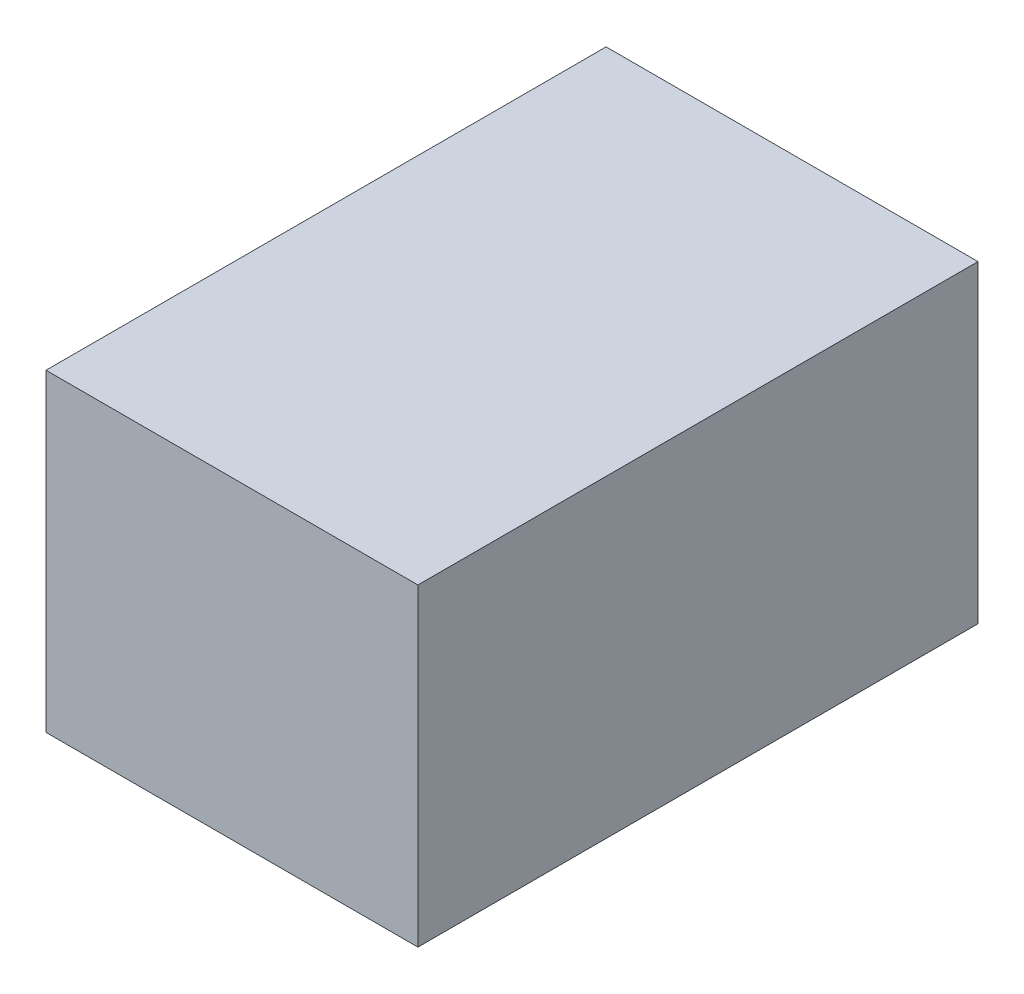
ISO-10303-21;
HEADER;
FILE_DESCRIPTION(('STEP AP214'),'2;1');
FILE_NAME('part.step','',(''),(''),'','','');
FILE_SCHEMA(('AUTOMOTIVE_DESIGN { 1 0 10303 214 1 1 1 1 }'));
ENDSEC;
DATA;
#1=APPLICATION_CONTEXT('core data for automotive mechanical design processes');
#2=APPLICATION_PROTOCOL_DEFINITION('international standard','automotive_design',2000,#1);
#3=PRODUCT_CONTEXT('',#1,'mechanical');
#4=PRODUCT('Part','Part','',(#3));
#5=PRODUCT_RELATED_PRODUCT_CATEGORY('part','',(#4));
#6=PRODUCT_DEFINITION_FORMATION('','',#4);
#7=PRODUCT_DEFINITION_CONTEXT('part definition',#1,'design');
#8=PRODUCT_DEFINITION('design','',#6,#7);
#9=PRODUCT_DEFINITION_SHAPE('','',#8);
#10=(LENGTH_UNIT() NAMED_UNIT(*) SI_UNIT(.MILLI.,.METRE.));
#11=(NAMED_UNIT(*) PLANE_ANGLE_UNIT() SI_UNIT($,.RADIAN.));
#12=(NAMED_UNIT(*) SI_UNIT($,.STERADIAN.) SOLID_ANGLE_UNIT());
#13=UNCERTAINTY_MEASURE_WITH_UNIT(LENGTH_MEASURE(1.E-05),#10,'distance_accuracy_value','');
#14=(GEOMETRIC_REPRESENTATION_CONTEXT(3) GLOBAL_UNCERTAINTY_ASSIGNED_CONTEXT((#13)) GLOBAL_UNIT_ASSIGNED_CONTEXT((#10,
#11,#12)) REPRESENTATION_CONTEXT('',''));
#15=CARTESIAN_POINT('',(0.,0.,0.));
#16=DIRECTION('',(0.,0.,1.));
#17=DIRECTION('',(1.,0.,0.));
#18=AXIS2_PLACEMENT_3D('',#15,#16,#17);
#19=CARTESIAN_POINT('',(-3.15,1.68383766961011,-5.12945897577526));
#20=DIRECTION('',(1.,0.,0.));
#21=DIRECTION('',(0.,0.,-1.));
#22=AXIS2_PLACEMENT_3D('',#19,#20,#21);
#23=PLANE('',#22);
#24=DIRECTION('',(0.,-0.173754346970263,-0.984789026598559));
#25=VECTOR('',#24,1.);
#26=CARTESIAN_POINT('',(-3.15,-0.0851061455947079,-3.64481386263141));
#27=LINE('',#26,#25);
#28=CARTESIAN_POINT('',(-3.15,-0.085106145594708,-3.64481386263141));
#29=VERTEX_POINT('',#28);
#30=CARTESIAN_POINT('',(-3.15,0.11552809239759,-2.50767744342807));
#31=VERTEX_POINT('',#30);
#32=EDGE_CURVE('E250',#29,#31,#27,.F.);
#33=ORIENTED_EDGE('',*,*,#32,.T.);
#34=DIRECTION('',(0.,-0.939729487887633,-0.341918834805057));
#35=VECTOR('',#34,1.);
#36=CARTESIAN_POINT('',(-3.15,0.11552809239759,-2.50767744342807));
#37=LINE('',#36,#35);
#38=CARTESIAN_POINT('',(-3.15,1.2006342379923,-2.11286358079666));
#39=VERTEX_POINT('',#38);
#40=EDGE_CURVE('E256',#31,#39,#37,.F.);
#41=ORIENTED_EDGE('',*,*,#40,.T.);
#42=DIRECTION('',(0.,-0.765975140917371,0.642870191793502));
#43=VECTOR('',#42,1.);
#44=CARTESIAN_POINT('',(-3.15,1.2006342379923,-2.11286358079666));
#45=LINE('',#44,#43);
#46=CARTESIAN_POINT('',(-3.15,2.08510614559471,-2.85518613736859));
#47=VERTEX_POINT('',#46);
#48=EDGE_CURVE('E262',#39,#47,#45,.F.);
#49=ORIENTED_EDGE('',*,*,#48,.T.);
#50=DIRECTION('',(0.,0.173754346970264,0.984789026598559));
#51=VECTOR('',#50,1.);
#52=CARTESIAN_POINT('',(-3.15,2.08510614559471,-2.85518613736859));
#53=LINE('',#52,#51);
#54=CARTESIAN_POINT('',(-3.15,1.88447190760241,-3.99232255657193));
#55=VERTEX_POINT('',#54);
#56=EDGE_CURVE('E145',#47,#55,#53,.F.);
#57=ORIENTED_EDGE('',*,*,#56,.T.);
#58=DIRECTION('',(0.,0.939729487887632,0.341918834805058));
#59=VECTOR('',#58,1.);
#60=CARTESIAN_POINT('',(-3.15,1.88447190760241,-3.99232255657193));
#61=LINE('',#60,#59);
#62=CARTESIAN_POINT('',(-3.15,0.799365762007703,-4.38713641920334));
#63=VERTEX_POINT('',#62);
#64=EDGE_CURVE('E127',#55,#63,#61,.F.);
#65=ORIENTED_EDGE('',*,*,#64,.T.);
#66=DIRECTION('',(0.,0.765975140917371,-0.642870191793502));
#67=VECTOR('',#66,1.);
#68=CARTESIAN_POINT('',(-3.15,0.799365762007703,-4.38713641920334));
#69=LINE('',#68,#67);
#70=EDGE_CURVE('E133',#63,#29,#69,.F.);
#71=ORIENTED_EDGE('',*,*,#70,.T.);
#72=EDGE_LOOP('',(#33,#41,#49,#57,#65,#71));
#73=FACE_BOUND('',#72,.T.);
#74=ADVANCED_FACE('F16',(#73),#23,.F.);
#75=CARTESIAN_POINT('',(-3.15,-0.154685570206259,3.24412060455637));
#76=DIRECTION('',(1.,0.,0.));
#77=DIRECTION('',(0.,0.,-1.));
#78=AXIS2_PLACEMENT_3D('',#75,#76,#77);
#79=PLANE('',#78);
#80=DIRECTION('',(0.,-0.999987037181939,-0.00509170581307389));
#81=VECTOR('',#80,1.);
#82=CARTESIAN_POINT('',(-3.15,0.417565509083797,4.24704733946012));
#83=LINE('',#82,#81);
#84=CARTESIAN_POINT('',(-3.15,0.417565509083797,4.24704733946012));
#85=VERTEX_POINT('',#84);
#86=CARTESIAN_POINT('',(-3.15,1.57225107929006,4.25292673490375));
#87=VERTEX_POINT('',#86);
#88=EDGE_CURVE('E215',#85,#87,#83,.F.);
#89=ORIENTED_EDGE('',*,*,#88,.T.);
#90=DIRECTION('',(0.,-0.504403065173688,0.863468324748157));
#91=VECTOR('',#90,1.);
#92=CARTESIAN_POINT('',(-3.15,1.57225107929006,4.25292673490375));
#93=LINE('',#92,#91);
#94=CARTESIAN_POINT('',(-3.15,2.15468557020626,3.25587939544362));
#95=VERTEX_POINT('',#94);
#96=EDGE_CURVE('E224',#87,#95,#93,.F.);
#97=ORIENTED_EDGE('',*,*,#96,.T.);
#98=DIRECTION('',(0.,0.495583972008252,0.86856003056123));
#99=VECTOR('',#98,1.);
#100=CARTESIAN_POINT('',(-3.15,2.15468557020626,3.25587939544362));
#101=LINE('',#100,#99);
#102=CARTESIAN_POINT('',(-3.15,1.5824344909162,2.25295266053987));
#103=VERTEX_POINT('',#102);
#104=EDGE_CURVE('E230',#95,#103,#101,.F.);
#105=ORIENTED_EDGE('',*,*,#104,.T.);
#106=DIRECTION('',(0.,0.999987037181939,0.00509170581307202));
#107=VECTOR('',#106,1.);
#108=CARTESIAN_POINT('',(-3.15,1.5824344909162,2.25295266053987));
#109=LINE('',#108,#107);
#110=CARTESIAN_POINT('',(-3.15,0.427748920709943,2.24707326509625));
#111=VERTEX_POINT('',#110);
#112=EDGE_CURVE('E236',#103,#111,#109,.F.);
#113=ORIENTED_EDGE('',*,*,#112,.T.);
#114=DIRECTION('',(0.,0.504403065173688,-0.863468324748156));
#115=VECTOR('',#114,1.);
#116=CARTESIAN_POINT('',(-3.15,0.427748920709943,2.24707326509625));
#117=LINE('',#116,#115);
#118=CARTESIAN_POINT('',(-3.15,-0.154685570206259,3.24412060455637));
#119=VERTEX_POINT('',#118);
#120=EDGE_CURVE('E242',#111,#119,#117,.F.);
#121=ORIENTED_EDGE('',*,*,#120,.T.);
#122=DIRECTION('',(0.,-0.495583972008252,-0.868560030561229));
#123=VECTOR('',#122,1.);
#124=CARTESIAN_POINT('',(-3.15,-0.154685570206259,3.24412060455637));
#125=LINE('',#124,#123);
#126=EDGE_CURVE('E245',#119,#85,#125,.F.);
#127=ORIENTED_EDGE('',*,*,#126,.T.);
#128=EDGE_LOOP('',(#89,#97,#105,#113,#121,#127));
#129=FACE_BOUND('',#128,.T.);
#130=ADVANCED_FACE('F552',(#129),#79,.F.);
#131=CARTESIAN_POINT('',(-3.15,0.799365762007703,-4.38713641920334));
#132=DIRECTION('',(0.,-0.642870191793502,-0.765975140917371));
#133=DIRECTION('',(0.,0.765975140917371,-0.642870191793502));
#134=AXIS2_PLACEMENT_3D('',#131,#132,#133);
#135=PLANE('',#134);
#136=DIRECTION('',(1.,0.,0.));
#137=VECTOR('',#136,1.);
#138=CARTESIAN_POINT('',(-3.15,-0.0851061455947079,-3.64481386263141));
#139=LINE('',#138,#137);
#140=CARTESIAN_POINT('',(-4.15,-0.0851061455947079,-3.64481386263141));
#141=VERTEX_POINT('',#140);
#142=EDGE_CURVE('E138',#141,#29,#139,.T.);
#143=ORIENTED_EDGE('',*,*,#142,.T.);
#144=ORIENTED_EDGE('',*,*,#70,.F.);
#145=DIRECTION('',(1.,0.,0.));
#146=VECTOR('',#145,1.);
#147=CARTESIAN_POINT('',(-3.15,0.799365762007703,-4.38713641920334));
#148=LINE('',#147,#146);
#149=CARTESIAN_POINT('',(-4.15,0.799365762007703,-4.38713641920334));
#150=VERTEX_POINT('',#149);
#151=EDGE_CURVE('E136',#63,#150,#148,.F.);
#152=ORIENTED_EDGE('',*,*,#151,.T.);
#153=DIRECTION('',(0.,0.765975140917371,-0.642870191793502));
#154=VECTOR('',#153,1.);
#155=CARTESIAN_POINT('',(-4.15,-0.0851061455947079,-3.64481386263141));
#156=LINE('',#155,#154);
#157=EDGE_CURVE('E210',#141,#150,#156,.T.);
#158=ORIENTED_EDGE('',*,*,#157,.F.);
#159=EDGE_LOOP('',(#143,#144,#152,#158));
#160=FACE_BOUND('',#159,.T.);
#161=ADVANCED_FACE('F134',(#160),#135,.F.);
#162=CARTESIAN_POINT('',(-3.15,1.88447190760241,-3.99232255657193));
#163=DIRECTION('',(0.,0.341918834805058,-0.939729487887632));
#164=DIRECTION('',(0.,0.939729487887632,0.341918834805058));
#165=AXIS2_PLACEMENT_3D('',#162,#163,#164);
#166=PLANE('',#165);
#167=ORIENTED_EDGE('',*,*,#151,.F.);
#168=ORIENTED_EDGE('',*,*,#64,.F.);
#169=DIRECTION('',(1.,0.,0.));
#170=VECTOR('',#169,1.);
#171=CARTESIAN_POINT('',(-3.15,1.88447190760241,-3.99232255657193));
#172=LINE('',#171,#170);
#173=CARTESIAN_POINT('',(-4.15,1.88447190760241,-3.99232255657193));
#174=VERTEX_POINT('',#173);
#175=EDGE_CURVE('E264',#55,#174,#172,.F.);
#176=ORIENTED_EDGE('',*,*,#175,.T.);
#177=DIRECTION('',(0.,0.939729487887632,0.341918834805058));
#178=VECTOR('',#177,1.);
#179=CARTESIAN_POINT('',(-4.15,0.799365762007703,-4.38713641920334));
#180=LINE('',#179,#178);
#181=EDGE_CURVE('E144',#150,#174,#180,.T.);
#182=ORIENTED_EDGE('',*,*,#181,.F.);
#183=EDGE_LOOP('',(#167,#168,#176,#182));
#184=FACE_BOUND('',#183,.T.);
#185=ADVANCED_FACE('F143',(#184),#166,.F.);
#186=CARTESIAN_POINT('',(-3.15,2.08510614559471,-2.85518613736859));
#187=DIRECTION('',(0.,0.984789026598559,-0.173754346970264));
#188=DIRECTION('',(0.,0.173754346970264,0.984789026598559));
#189=AXIS2_PLACEMENT_3D('',#186,#187,#188);
#190=PLANE('',#189);
#191=ORIENTED_EDGE('',*,*,#175,.F.);
#192=ORIENTED_EDGE('',*,*,#56,.F.);
#193=DIRECTION('',(1.,0.,0.));
#194=VECTOR('',#193,1.);
#195=CARTESIAN_POINT('',(-3.15,2.08510614559471,-2.85518613736859));
#196=LINE('',#195,#194);
#197=CARTESIAN_POINT('',(-4.15,2.08510614559471,-2.85518613736859));
#198=VERTEX_POINT('',#197);
#199=EDGE_CURVE('E259',#47,#198,#196,.F.);
#200=ORIENTED_EDGE('',*,*,#199,.T.);
#201=DIRECTION('',(0.,0.173754346970264,0.984789026598559));
#202=VECTOR('',#201,1.);
#203=CARTESIAN_POINT('',(-4.15,1.88447190760241,-3.99232255657193));
#204=LINE('',#203,#202);
#205=EDGE_CURVE('E207',#174,#198,#204,.T.);
#206=ORIENTED_EDGE('',*,*,#205,.F.);
#207=EDGE_LOOP('',(#191,#192,#200,#206));
#208=FACE_BOUND('',#207,.T.);
#209=ADVANCED_FACE('F267',(#208),#190,.F.);
#210=CARTESIAN_POINT('',(-3.15,1.2006342379923,-2.11286358079666));
#211=DIRECTION('',(0.,0.642870191793502,0.765975140917371));
#212=DIRECTION('',(0.,-0.765975140917371,0.642870191793502));
#213=AXIS2_PLACEMENT_3D('',#210,#211,#212);
#214=PLANE('',#213);
#215=ORIENTED_EDGE('',*,*,#199,.F.);
#216=ORIENTED_EDGE('',*,*,#48,.F.);
#217=DIRECTION('',(1.,0.,0.));
#218=VECTOR('',#217,1.);
#219=CARTESIAN_POINT('',(-3.15,1.2006342379923,-2.11286358079666));
#220=LINE('',#219,#218);
#221=CARTESIAN_POINT('',(-4.15,1.2006342379923,-2.11286358079666));
#222=VERTEX_POINT('',#221);
#223=EDGE_CURVE('E253',#39,#222,#220,.F.);
#224=ORIENTED_EDGE('',*,*,#223,.T.);
#225=DIRECTION('',(0.,-0.765975140917371,0.642870191793502));
#226=VECTOR('',#225,1.);
#227=CARTESIAN_POINT('',(-4.15,2.08510614559471,-2.85518613736859));
#228=LINE('',#227,#226);
#229=EDGE_CURVE('E205',#198,#222,#228,.T.);
#230=ORIENTED_EDGE('',*,*,#229,.F.);
#231=EDGE_LOOP('',(#215,#216,#224,#230));
#232=FACE_BOUND('',#231,.T.);
#233=ADVANCED_FACE('F281',(#232),#214,.F.);
#234=CARTESIAN_POINT('',(-3.15,0.11552809239759,-2.50767744342807));
#235=DIRECTION('',(0.,-0.341918834805057,0.939729487887633));
#236=DIRECTION('',(0.,-0.939729487887633,-0.341918834805057));
#237=AXIS2_PLACEMENT_3D('',#234,#235,#236);
#238=PLANE('',#237);
#239=ORIENTED_EDGE('',*,*,#223,.F.);
#240=ORIENTED_EDGE('',*,*,#40,.F.);
#241=DIRECTION('',(1.,0.,0.));
#242=VECTOR('',#241,1.);
#243=CARTESIAN_POINT('',(-3.15,0.11552809239759,-2.50767744342807));
#244=LINE('',#243,#242);
#245=CARTESIAN_POINT('',(-4.15,0.11552809239759,-2.50767744342807));
#246=VERTEX_POINT('',#245);
#247=EDGE_CURVE('E247',#31,#246,#244,.F.);
#248=ORIENTED_EDGE('',*,*,#247,.T.);
#249=DIRECTION('',(0.,-0.939729487887632,-0.341918834805057));
#250=VECTOR('',#249,1.);
#251=CARTESIAN_POINT('',(-4.15,1.2006342379923,-2.11286358079666));
#252=LINE('',#251,#250);
#253=EDGE_CURVE('E203',#222,#246,#252,.T.);
#254=ORIENTED_EDGE('',*,*,#253,.F.);
#255=EDGE_LOOP('',(#239,#240,#248,#254));
#256=FACE_BOUND('',#255,.T.);
#257=ADVANCED_FACE('F279',(#256),#238,.F.);
#258=CARTESIAN_POINT('',(-3.15,-0.0851061455947079,-3.64481386263141));
#259=DIRECTION('',(0.,-0.984789026598559,0.173754346970263));
#260=DIRECTION('',(0.,-0.173754346970263,-0.984789026598559));
#261=AXIS2_PLACEMENT_3D('',#258,#259,#260);
#262=PLANE('',#261);
#263=ORIENTED_EDGE('',*,*,#247,.F.);
#264=ORIENTED_EDGE('',*,*,#32,.F.);
#265=ORIENTED_EDGE('',*,*,#142,.F.);
#266=DIRECTION('',(0.,-0.173754346970263,-0.984789026598559));
#267=VECTOR('',#266,1.);
#268=CARTESIAN_POINT('',(-4.15,0.11552809239759,-2.50767744342807));
#269=LINE('',#268,#267);
#270=EDGE_CURVE('E200',#246,#141,#269,.T.);
#271=ORIENTED_EDGE('',*,*,#270,.F.);
#272=EDGE_LOOP('',(#263,#264,#265,#271));
#273=FACE_BOUND('',#272,.T.);
#274=ADVANCED_FACE('F276',(#273),#262,.F.);
#275=CARTESIAN_POINT('',(-3.15,-0.154685570206259,3.24412060455637));
#276=DIRECTION('',(0.,-0.868560030561229,0.495583972008252));
#277=DIRECTION('',(0.,-0.495583972008252,-0.868560030561229));
#278=AXIS2_PLACEMENT_3D('',#275,#276,#277);
#279=PLANE('',#278);
#280=DIRECTION('',(1.,0.,0.));
#281=VECTOR('',#280,1.);
#282=CARTESIAN_POINT('',(-3.15,0.417565509083797,4.24704733946012));
#283=LINE('',#282,#281);
#284=CARTESIAN_POINT('',(-4.15,0.417565509083797,4.24704733946012));
#285=VERTEX_POINT('',#284);
#286=EDGE_CURVE('E218',#285,#85,#283,.T.);
#287=ORIENTED_EDGE('',*,*,#286,.T.);
#288=ORIENTED_EDGE('',*,*,#126,.F.);
#289=DIRECTION('',(1.,0.,0.));
#290=VECTOR('',#289,1.);
#291=CARTESIAN_POINT('',(-3.15,-0.154685570206259,3.24412060455637));
#292=LINE('',#291,#290);
#293=CARTESIAN_POINT('',(-4.15,-0.154685570206259,3.24412060455637));
#294=VERTEX_POINT('',#293);
#295=EDGE_CURVE('E239',#119,#294,#292,.F.);
#296=ORIENTED_EDGE('',*,*,#295,.T.);
#297=DIRECTION('',(0.,-0.495583972008252,-0.868560030561229));
#298=VECTOR('',#297,1.);
#299=CARTESIAN_POINT('',(-4.15,0.417565509083797,4.24704733946012));
#300=LINE('',#299,#298);
#301=EDGE_CURVE('E198',#285,#294,#300,.T.);
#302=ORIENTED_EDGE('',*,*,#301,.F.);
#303=EDGE_LOOP('',(#287,#288,#296,#302));
#304=FACE_BOUND('',#303,.T.);
#305=ADVANCED_FACE('F375',(#304),#279,.F.);
#306=CARTESIAN_POINT('',(-3.15,0.427748920709943,2.24707326509625));
#307=DIRECTION('',(0.,-0.863468324748156,-0.504403065173688));
#308=DIRECTION('',(0.,0.504403065173688,-0.863468324748156));
#309=AXIS2_PLACEMENT_3D('',#306,#307,#308);
#310=PLANE('',#309);
#311=ORIENTED_EDGE('',*,*,#295,.F.);
#312=ORIENTED_EDGE('',*,*,#120,.F.);
#313=DIRECTION('',(1.,0.,0.));
#314=VECTOR('',#313,1.);
#315=CARTESIAN_POINT('',(-3.15,0.427748920709943,2.24707326509625));
#316=LINE('',#315,#314);
#317=CARTESIAN_POINT('',(-4.15,0.427748920709943,2.24707326509625));
#318=VERTEX_POINT('',#317);
#319=EDGE_CURVE('E233',#111,#318,#316,.F.);
#320=ORIENTED_EDGE('',*,*,#319,.T.);
#321=DIRECTION('',(0.,0.504403065173688,-0.863468324748157));
#322=VECTOR('',#321,1.);
#323=CARTESIAN_POINT('',(-4.15,-0.154685570206259,3.24412060455637));
#324=LINE('',#323,#322);
#325=EDGE_CURVE('E196',#294,#318,#324,.T.);
#326=ORIENTED_EDGE('',*,*,#325,.F.);
#327=EDGE_LOOP('',(#311,#312,#320,#326));
#328=FACE_BOUND('',#327,.T.);
#329=ADVANCED_FACE('F371',(#328),#310,.F.);
#330=CARTESIAN_POINT('',(-3.15,1.5824344909162,2.25295266053987));
#331=DIRECTION('',(0.,0.00509170581307202,-0.999987037181939));
#332=DIRECTION('',(0.,0.999987037181939,0.00509170581307202));
#333=AXIS2_PLACEMENT_3D('',#330,#331,#332);
#334=PLANE('',#333);
#335=ORIENTED_EDGE('',*,*,#319,.F.);
#336=ORIENTED_EDGE('',*,*,#112,.F.);
#337=DIRECTION('',(1.,0.,0.));
#338=VECTOR('',#337,1.);
#339=CARTESIAN_POINT('',(-3.15,1.5824344909162,2.25295266053987));
#340=LINE('',#339,#338);
#341=CARTESIAN_POINT('',(-4.15,1.5824344909162,2.25295266053987));
#342=VERTEX_POINT('',#341);
#343=EDGE_CURVE('E227',#103,#342,#340,.F.);
#344=ORIENTED_EDGE('',*,*,#343,.T.);
#345=DIRECTION('',(0.,0.999987037181939,0.00509170581307202));
#346=VECTOR('',#345,1.);
#347=CARTESIAN_POINT('',(-4.15,0.427748920709943,2.24707326509625));
#348=LINE('',#347,#346);
#349=EDGE_CURVE('E194',#318,#342,#348,.T.);
#350=ORIENTED_EDGE('',*,*,#349,.F.);
#351=EDGE_LOOP('',(#335,#336,#344,#350));
#352=FACE_BOUND('',#351,.T.);
#353=ADVANCED_FACE('F367',(#352),#334,.F.);
#354=CARTESIAN_POINT('',(-3.15,2.15468557020626,3.25587939544362));
#355=DIRECTION('',(0.,0.86856003056123,-0.495583972008252));
#356=DIRECTION('',(0.,0.495583972008252,0.86856003056123));
#357=AXIS2_PLACEMENT_3D('',#354,#355,#356);
#358=PLANE('',#357);
#359=ORIENTED_EDGE('',*,*,#343,.F.);
#360=ORIENTED_EDGE('',*,*,#104,.F.);
#361=DIRECTION('',(1.,0.,0.));
#362=VECTOR('',#361,1.);
#363=CARTESIAN_POINT('',(-3.15,2.15468557020626,3.25587939544362));
#364=LINE('',#363,#362);
#365=CARTESIAN_POINT('',(-4.15,2.15468557020626,3.25587939544362));
#366=VERTEX_POINT('',#365);
#367=EDGE_CURVE('E221',#95,#366,#364,.F.);
#368=ORIENTED_EDGE('',*,*,#367,.T.);
#369=DIRECTION('',(0.,0.495583972008252,0.86856003056123));
#370=VECTOR('',#369,1.);
#371=CARTESIAN_POINT('',(-4.15,1.5824344909162,2.25295266053987));
#372=LINE('',#371,#370);
#373=EDGE_CURVE('E189',#342,#366,#372,.T.);
#374=ORIENTED_EDGE('',*,*,#373,.F.);
#375=EDGE_LOOP('',(#359,#360,#368,#374));
#376=FACE_BOUND('',#375,.T.);
#377=ADVANCED_FACE('F363',(#376),#358,.F.);
#378=CARTESIAN_POINT('',(-3.15,1.57225107929006,4.25292673490375));
#379=DIRECTION('',(0.,0.863468324748157,0.504403065173688));
#380=DIRECTION('',(0.,-0.504403065173688,0.863468324748157));
#381=AXIS2_PLACEMENT_3D('',#378,#379,#380);
#382=PLANE('',#381);
#383=ORIENTED_EDGE('',*,*,#367,.F.);
#384=ORIENTED_EDGE('',*,*,#96,.F.);
#385=DIRECTION('',(1.,0.,0.));
#386=VECTOR('',#385,1.);
#387=CARTESIAN_POINT('',(-3.15,1.57225107929006,4.25292673490375));
#388=LINE('',#387,#386);
#389=CARTESIAN_POINT('',(-4.15,1.57225107929006,4.25292673490375));
#390=VERTEX_POINT('',#389);
#391=EDGE_CURVE('E212',#87,#390,#388,.F.);
#392=ORIENTED_EDGE('',*,*,#391,.T.);
#393=DIRECTION('',(0.,-0.504403065173688,0.863468324748157));
#394=VECTOR('',#393,1.);
#395=CARTESIAN_POINT('',(-4.15,2.15468557020626,3.25587939544362));
#396=LINE('',#395,#394);
#397=EDGE_CURVE('E184',#366,#390,#396,.T.);
#398=ORIENTED_EDGE('',*,*,#397,.F.);
#399=EDGE_LOOP('',(#383,#384,#392,#398));
#400=FACE_BOUND('',#399,.T.);
#401=ADVANCED_FACE('F359',(#400),#382,.F.);
#402=CARTESIAN_POINT('',(-3.15,0.417565509083797,4.24704733946012));
#403=DIRECTION('',(0.,-0.00509170581307389,0.999987037181939));
#404=DIRECTION('',(0.,-0.999987037181939,-0.00509170581307389));
#405=AXIS2_PLACEMENT_3D('',#402,#403,#404);
#406=PLANE('',#405);
#407=ORIENTED_EDGE('',*,*,#391,.F.);
#408=ORIENTED_EDGE('',*,*,#88,.F.);
#409=ORIENTED_EDGE('',*,*,#286,.F.);
#410=DIRECTION('',(0.,-0.999987037181939,-0.00509170581307389));
#411=VECTOR('',#410,1.);
#412=CARTESIAN_POINT('',(-4.15,1.57225107929006,4.25292673490375));
#413=LINE('',#412,#411);
#414=EDGE_CURVE('E180',#390,#285,#413,.T.);
#415=ORIENTED_EDGE('',*,*,#414,.F.);
#416=EDGE_LOOP('',(#407,#408,#409,#415));
#417=FACE_BOUND('',#416,.T.);
#418=ADVANCED_FACE('F355',(#417),#406,.F.);
#419=CARTESIAN_POINT('',(-4.15,1.,-3.25));
#420=DIRECTION('',(-1.,0.,0.));
#421=DIRECTION('',(0.,0.,1.));
#422=AXIS2_PLACEMENT_3D('',#419,#420,#421);
#423=PLANE('',#422);
#424=CARTESIAN_POINT('',(-4.14999999998145,1.,-3.25));
#425=DIRECTION('',(1.,0.,0.));
#426=DIRECTION('',(0.,0.,-1.));
#427=AXIS2_PLACEMENT_3D('',#424,#425,#426);
#428=CIRCLE('',#427,2.02499999998327);
#429=CARTESIAN_POINT('',(-4.14999999998145,1.,-5.27499999998327));
#430=VERTEX_POINT('',#429);
#431=EDGE_CURVE('E19',#430,#430,#428,.T.);
#432=ORIENTED_EDGE('',*,*,#431,.F.);
#433=EDGE_LOOP('',(#432));
#434=FACE_BOUND('',#433,.T.);
#435=ORIENTED_EDGE('',*,*,#253,.T.);
#436=ORIENTED_EDGE('',*,*,#270,.T.);
#437=ORIENTED_EDGE('',*,*,#157,.T.);
#438=ORIENTED_EDGE('',*,*,#181,.T.);
#439=ORIENTED_EDGE('',*,*,#205,.T.);
#440=ORIENTED_EDGE('',*,*,#229,.T.);
#441=EDGE_LOOP('',(#435,#436,#437,#438,#439,#440));
#442=FACE_BOUND('',#441,.T.);
#443=ADVANCED_FACE('F271',(#434,#442),#423,.T.);
#444=CARTESIAN_POINT('',(-4.15,1.,3.25));
#445=DIRECTION('',(-1.,0.,0.));
#446=DIRECTION('',(0.,0.,1.));
#447=AXIS2_PLACEMENT_3D('',#444,#445,#446);
#448=PLANE('',#447);
#449=CARTESIAN_POINT('',(-4.15000000003829,1.,3.25));
#450=DIRECTION('',(1.,0.,0.));
#451=DIRECTION('',(0.,0.,-1.));
#452=AXIS2_PLACEMENT_3D('',#449,#450,#451);
#453=CIRCLE('',#452,2.02500000002328);
#454=CARTESIAN_POINT('',(-4.15000000003829,1.,1.22499999997672));
#455=VERTEX_POINT('',#454);
#456=EDGE_CURVE('E172',#455,#455,#453,.T.);
#457=ORIENTED_EDGE('',*,*,#456,.F.);
#458=EDGE_LOOP('',(#457));
#459=FACE_BOUND('',#458,.T.);
#460=ORIENTED_EDGE('',*,*,#397,.T.);
#461=ORIENTED_EDGE('',*,*,#414,.T.);
#462=ORIENTED_EDGE('',*,*,#301,.T.);
#463=ORIENTED_EDGE('',*,*,#325,.T.);
#464=ORIENTED_EDGE('',*,*,#349,.T.);
#465=ORIENTED_EDGE('',*,*,#373,.T.);
#466=EDGE_LOOP('',(#460,#461,#462,#463,#464,#465));
#467=FACE_BOUND('',#466,.T.);
#468=ADVANCED_FACE('F349',(#459,#467),#448,.T.);
#469=CARTESIAN_POINT('',(-3.92500000003793,1.,-3.25));
#470=DIRECTION('',(1.,0.,0.));
#471=DIRECTION('',(0.,0.,-1.));
#472=AXIS2_PLACEMENT_3D('',#469,#470,#471);
#473=CONICAL_SURFACE('',#472,2.24999999992679,0.785398163397448);
#474=ORIENTED_EDGE('',*,*,#431,.T.);
#475=EDGE_LOOP('',(#474));
#476=FACE_BOUND('',#475,.T.);
#477=CARTESIAN_POINT('',(-3.925,1.,-3.25));
#478=DIRECTION('',(1.,0.,0.));
#479=DIRECTION('',(0.,0.,-1.));
#480=AXIS2_PLACEMENT_3D('',#477,#478,#479);
#481=CIRCLE('',#480,2.25);
#482=CARTESIAN_POINT('',(-3.925,1.,-5.5));
#483=VERTEX_POINT('',#482);
#484=EDGE_CURVE('E174',#483,#483,#481,.T.);
#485=ORIENTED_EDGE('',*,*,#484,.F.);
#486=EDGE_LOOP('',(#485));
#487=FACE_BOUND('',#486,.T.);
#488=ADVANCED_FACE('F345',(#476,#487),#473,.T.);
#489=CARTESIAN_POINT('',(-3.92500000003793,1.,3.25));
#490=DIRECTION('',(1.,0.,0.));
#491=DIRECTION('',(0.,0.,-1.));
#492=AXIS2_PLACEMENT_3D('',#489,#490,#491);
#493=CONICAL_SURFACE('',#492,2.25000000002365,0.785398163397448);
#494=CARTESIAN_POINT('',(-3.925,1.,3.25));
#495=DIRECTION('',(1.,0.,0.));
#496=DIRECTION('',(0.,0.,-1.));
#497=AXIS2_PLACEMENT_3D('',#494,#495,#496);
#498=CIRCLE('',#497,2.25);
#499=CARTESIAN_POINT('',(-3.925,1.,0.999999999999998));
#500=VERTEX_POINT('',#499);
#501=EDGE_CURVE('E171',#500,#500,#498,.T.);
#502=ORIENTED_EDGE('',*,*,#501,.F.);
#503=EDGE_LOOP('',(#502));
#504=FACE_BOUND('',#503,.T.);
#505=ORIENTED_EDGE('',*,*,#456,.T.);
#506=EDGE_LOOP('',(#505));
#507=FACE_BOUND('',#506,.T.);
#508=ADVANCED_FACE('F341',(#504,#507),#493,.T.);
#509=CARTESIAN_POINT('',(-4.15,1.,-3.25));
#510=DIRECTION('',(1.,0.,0.));
#511=DIRECTION('',(0.,0.,-1.));
#512=AXIS2_PLACEMENT_3D('',#509,#510,#511);
#513=CYLINDRICAL_SURFACE('',#512,2.25);
#514=ORIENTED_EDGE('',*,*,#484,.T.);
#515=EDGE_LOOP('',(#514));
#516=FACE_BOUND('',#515,.T.);
#517=CARTESIAN_POINT('',(-2.15,1.,-3.25));
#518=DIRECTION('',(1.,0.,0.));
#519=DIRECTION('',(0.,0.,-1.));
#520=AXIS2_PLACEMENT_3D('',#517,#518,#519);
#521=CIRCLE('',#520,2.25);
#522=CARTESIAN_POINT('',(-2.15,1.,-5.5));
#523=VERTEX_POINT('',#522);
#524=EDGE_CURVE('E169',#523,#523,#521,.F.);
#525=ORIENTED_EDGE('',*,*,#524,.T.);
#526=EDGE_LOOP('',(#525));
#527=FACE_BOUND('',#526,.T.);
#528=ADVANCED_FACE('F337',(#516,#527),#513,.T.);
#529=CARTESIAN_POINT('',(-4.15,1.,3.25));
#530=DIRECTION('',(1.,0.,0.));
#531=DIRECTION('',(0.,0.,-1.));
#532=AXIS2_PLACEMENT_3D('',#529,#530,#531);
#533=CYLINDRICAL_SURFACE('',#532,2.25);
#534=CARTESIAN_POINT('',(-2.15,1.,3.25));
#535=DIRECTION('',(1.,0.,0.));
#536=DIRECTION('',(0.,0.,-1.));
#537=AXIS2_PLACEMENT_3D('',#534,#535,#536);
#538=CIRCLE('',#537,2.25);
#539=CARTESIAN_POINT('',(-2.15,1.,0.999999999999998));
#540=VERTEX_POINT('',#539);
#541=EDGE_CURVE('E166',#540,#540,#538,.T.);
#542=ORIENTED_EDGE('',*,*,#541,.F.);
#543=EDGE_LOOP('',(#542));
#544=FACE_BOUND('',#543,.T.);
#545=ORIENTED_EDGE('',*,*,#501,.T.);
#546=EDGE_LOOP('',(#545));
#547=FACE_BOUND('',#546,.T.);
#548=ADVANCED_FACE('F333',(#544,#547),#533,.T.);
#549=CARTESIAN_POINT('',(-2.15,1.,-3.25));
#550=DIRECTION('',(1.,0.,0.));
#551=DIRECTION('',(0.,0.,-1.));
#552=AXIS2_PLACEMENT_3D('',#549,#550,#551);
#553=PLANE('',#552);
#554=ORIENTED_EDGE('',*,*,#524,.F.);
#555=EDGE_LOOP('',(#554));
#556=FACE_BOUND('',#555,.T.);
#557=CARTESIAN_POINT('',(-2.15,1.,-3.25));
#558=DIRECTION('',(-1.,0.,0.));
#559=DIRECTION('',(0.,0.,1.));
#560=AXIS2_PLACEMENT_3D('',#557,#558,#559);
#561=CIRCLE('',#560,2.3);
#562=CARTESIAN_POINT('',(-2.15,1.,-0.95));
#563=VERTEX_POINT('',#562);
#564=EDGE_CURVE('E163',#563,#563,#561,.T.);
#565=ORIENTED_EDGE('',*,*,#564,.T.);
#566=EDGE_LOOP('',(#565));
#567=FACE_BOUND('',#566,.T.);
#568=ADVANCED_FACE('F329',(#556,#567),#553,.F.);
#569=CARTESIAN_POINT('',(-2.15,1.,3.25));
#570=DIRECTION('',(-1.,0.,0.));
#571=DIRECTION('',(0.,0.,1.));
#572=AXIS2_PLACEMENT_3D('',#569,#570,#571);
#573=PLANE('',#572);
#574=ORIENTED_EDGE('',*,*,#541,.T.);
#575=EDGE_LOOP('',(#574));
#576=FACE_BOUND('',#575,.T.);
#577=CARTESIAN_POINT('',(-2.15,1.,3.25));
#578=DIRECTION('',(-1.,0.,0.));
#579=DIRECTION('',(0.,0.,1.));
#580=AXIS2_PLACEMENT_3D('',#577,#578,#579);
#581=CIRCLE('',#580,2.3);
#582=CARTESIAN_POINT('',(-2.15,1.,5.55));
#583=VERTEX_POINT('',#582);
#584=EDGE_CURVE('E160',#583,#583,#581,.T.);
#585=ORIENTED_EDGE('',*,*,#584,.T.);
#586=EDGE_LOOP('',(#585));
#587=FACE_BOUND('',#586,.T.);
#588=ADVANCED_FACE('F325',(#576,#587),#573,.T.);
#589=CARTESIAN_POINT('',(-2.15,1.,-3.25));
#590=DIRECTION('',(-1.,0.,0.));
#591=DIRECTION('',(0.,0.,1.));
#592=AXIS2_PLACEMENT_3D('',#589,#590,#591);
#593=CYLINDRICAL_SURFACE('',#592,2.3);
#594=CARTESIAN_POINT('',(-4.15,1.,-3.25));
#595=DIRECTION('',(-1.,0.,0.));
#596=DIRECTION('',(0.,0.,1.));
#597=AXIS2_PLACEMENT_3D('',#594,#595,#596);
#598=CIRCLE('',#597,2.3);
#599=CARTESIAN_POINT('',(-4.15,1.,-0.95));
#600=VERTEX_POINT('',#599);
#601=EDGE_CURVE('E157',#600,#600,#598,.T.);
#602=ORIENTED_EDGE('',*,*,#601,.T.);
#603=EDGE_LOOP('',(#602));
#604=FACE_BOUND('',#603,.T.);
#605=ORIENTED_EDGE('',*,*,#564,.F.);
#606=EDGE_LOOP('',(#605));
#607=FACE_BOUND('',#606,.T.);
#608=ADVANCED_FACE('F321',(#604,#607),#593,.F.);
#609=CARTESIAN_POINT('',(-2.15,1.,3.25));
#610=DIRECTION('',(-1.,0.,0.));
#611=DIRECTION('',(0.,0.,1.));
#612=AXIS2_PLACEMENT_3D('',#609,#610,#611);
#613=CYLINDRICAL_SURFACE('',#612,2.3);
#614=CARTESIAN_POINT('',(-4.15,1.,3.25));
#615=DIRECTION('',(-1.,0.,0.));
#616=DIRECTION('',(0.,0.,1.));
#617=AXIS2_PLACEMENT_3D('',#614,#615,#616);
#618=CIRCLE('',#617,2.3);
#619=CARTESIAN_POINT('',(-4.15,1.,5.55));
#620=VERTEX_POINT('',#619);
#621=EDGE_CURVE('E152',#620,#620,#618,.T.);
#622=ORIENTED_EDGE('',*,*,#621,.T.);
#623=EDGE_LOOP('',(#622));
#624=FACE_BOUND('',#623,.T.);
#625=ORIENTED_EDGE('',*,*,#584,.F.);
#626=EDGE_LOOP('',(#625));
#627=FACE_BOUND('',#626,.T.);
#628=ADVANCED_FACE('F317',(#624,#627),#613,.F.);
#629=CARTESIAN_POINT('',(-4.15,3.5,6.25));
#630=DIRECTION('',(0.,-1.,0.));
#631=DIRECTION('',(1.,0.,0.));
#632=AXIS2_PLACEMENT_3D('',#629,#630,#631);
#633=PLANE('',#632);
#634=DIRECTION('',(0.,0.,-1.));
#635=VECTOR('',#634,1.);
#636=CARTESIAN_POINT('',(-4.15,3.5,6.25));
#637=LINE('',#636,#635);
#638=CARTESIAN_POINT('',(-4.15,3.5,-6.25));
#639=VERTEX_POINT('',#638);
#640=CARTESIAN_POINT('',(-4.15,3.5,6.25));
#641=VERTEX_POINT('',#640);
#642=EDGE_CURVE('E156',#639,#641,#637,.F.);
#643=ORIENTED_EDGE('',*,*,#642,.T.);
#644=DIRECTION('',(1.,0.,0.));
#645=VECTOR('',#644,1.);
#646=CARTESIAN_POINT('',(-4.15,3.5,6.25));
#647=LINE('',#646,#645);
#648=CARTESIAN_POINT('',(4.15,3.5,6.25));
#649=VERTEX_POINT('',#648);
#650=EDGE_CURVE('E626',#649,#641,#647,.F.);
#651=ORIENTED_EDGE('',*,*,#650,.F.);
#652=DIRECTION('',(0.,0.,1.));
#653=VECTOR('',#652,1.);
#654=CARTESIAN_POINT('',(4.15,3.5,6.25));
#655=LINE('',#654,#653);
#656=CARTESIAN_POINT('',(4.15,3.5,-6.25));
#657=VERTEX_POINT('',#656);
#658=EDGE_CURVE('E632',#649,#657,#655,.F.);
#659=ORIENTED_EDGE('',*,*,#658,.T.);
#660=DIRECTION('',(1.,0.,0.));
#661=VECTOR('',#660,1.);
#662=CARTESIAN_POINT('',(-4.15,3.5,-6.25));
#663=LINE('',#662,#661);
#664=EDGE_CURVE('E635',#657,#639,#663,.F.);
#665=ORIENTED_EDGE('',*,*,#664,.T.);
#666=EDGE_LOOP('',(#643,#651,#659,#665));
#667=FACE_BOUND('',#666,.T.);
#668=ADVANCED_FACE('F313',(#667),#633,.F.);
#669=CARTESIAN_POINT('',(-4.15,3.5,6.25));
#670=DIRECTION('',(1.,0.,0.));
#671=DIRECTION('',(0.,0.,-1.));
#672=AXIS2_PLACEMENT_3D('',#669,#670,#671);
#673=PLANE('',#672);
#674=ORIENTED_EDGE('',*,*,#621,.F.);
#675=EDGE_LOOP('',(#674));
#676=FACE_BOUND('',#675,.T.);
#677=DIRECTION('',(0.,0.,1.));
#678=VECTOR('',#677,1.);
#679=CARTESIAN_POINT('',(-4.15,-3.5,6.25));
#680=LINE('',#679,#678);
#681=CARTESIAN_POINT('',(-4.15,-3.5,-6.25));
#682=VERTEX_POINT('',#681);
#683=CARTESIAN_POINT('',(-4.15,-3.5,6.25));
#684=VERTEX_POINT('',#683);
#685=EDGE_CURVE('E641',#682,#684,#680,.T.);
#686=ORIENTED_EDGE('',*,*,#685,.T.);
#687=DIRECTION('',(0.,1.,0.));
#688=VECTOR('',#687,1.);
#689=CARTESIAN_POINT('',(-4.15,-3.5,6.25));
#690=LINE('',#689,#688);
#691=EDGE_CURVE('E155',#641,#684,#690,.F.);
#692=ORIENTED_EDGE('',*,*,#691,.F.);
#693=ORIENTED_EDGE('',*,*,#642,.F.);
#694=DIRECTION('',(0.,1.,0.));
#695=VECTOR('',#694,1.);
#696=CARTESIAN_POINT('',(-4.15,-3.5,-6.25));
#697=LINE('',#696,#695);
#698=EDGE_CURVE('E638',#639,#682,#697,.F.);
#699=ORIENTED_EDGE('',*,*,#698,.T.);
#700=EDGE_LOOP('',(#686,#692,#693,#699));
#701=FACE_BOUND('',#700,.T.);
#702=ORIENTED_EDGE('',*,*,#601,.F.);
#703=EDGE_LOOP('',(#702));
#704=FACE_BOUND('',#703,.T.);
#705=ADVANCED_FACE('F309',(#676,#701,#704),#673,.F.);
#706=CARTESIAN_POINT('',(-4.15,-3.5,6.25));
#707=DIRECTION('',(0.,0.,1.));
#708=DIRECTION('',(1.,0.,0.));
#709=AXIS2_PLACEMENT_3D('',#706,#707,#708);
#710=PLANE('',#709);
#711=DIRECTION('',(0.,1.,0.));
#712=VECTOR('',#711,1.);
#713=CARTESIAN_POINT('',(4.15,3.5,6.25));
#714=LINE('',#713,#712);
#715=CARTESIAN_POINT('',(4.15,-3.5,6.25));
#716=VERTEX_POINT('',#715);
#717=EDGE_CURVE('E629',#716,#649,#714,.T.);
#718=ORIENTED_EDGE('',*,*,#717,.T.);
#719=ORIENTED_EDGE('',*,*,#650,.T.);
#720=ORIENTED_EDGE('',*,*,#691,.T.);
#721=DIRECTION('',(-1.,0.,0.));
#722=VECTOR('',#721,1.);
#723=CARTESIAN_POINT('',(-4.15,-3.5,6.25));
#724=LINE('',#723,#722);
#725=EDGE_CURVE('E644',#684,#716,#724,.F.);
#726=ORIENTED_EDGE('',*,*,#725,.T.);
#727=EDGE_LOOP('',(#718,#719,#720,#726));
#728=FACE_BOUND('',#727,.T.);
#729=ADVANCED_FACE('F305',(#728),#710,.T.);
#730=CARTESIAN_POINT('',(4.15,3.5,6.25));
#731=DIRECTION('',(-1.,0.,0.));
#732=DIRECTION('',(0.,0.,1.));
#733=AXIS2_PLACEMENT_3D('',#730,#731,#732);
#734=PLANE('',#733);
#735=ORIENTED_EDGE('',*,*,#658,.F.);
#736=ORIENTED_EDGE('',*,*,#717,.F.);
#737=DIRECTION('',(0.,0.,1.));
#738=VECTOR('',#737,1.);
#739=CARTESIAN_POINT('',(4.15,-3.5,6.25));
#740=LINE('',#739,#738);
#741=CARTESIAN_POINT('',(4.15,-3.5,-6.25));
#742=VERTEX_POINT('',#741);
#743=EDGE_CURVE('E25',#716,#742,#740,.F.);
#744=ORIENTED_EDGE('',*,*,#743,.T.);
#745=DIRECTION('',(0.,1.,0.));
#746=VECTOR('',#745,1.);
#747=CARTESIAN_POINT('',(4.15,-3.5,-6.25));
#748=LINE('',#747,#746);
#749=EDGE_CURVE('E33',#742,#657,#748,.T.);
#750=ORIENTED_EDGE('',*,*,#749,.T.);
#751=EDGE_LOOP('',(#735,#736,#744,#750));
#752=FACE_BOUND('',#751,.T.);
#753=ADVANCED_FACE('F299',(#752),#734,.F.);
#754=CARTESIAN_POINT('',(-4.15,-3.5,-6.25));
#755=DIRECTION('',(0.,0.,1.));
#756=DIRECTION('',(1.,0.,0.));
#757=AXIS2_PLACEMENT_3D('',#754,#755,#756);
#758=PLANE('',#757);
#759=ORIENTED_EDGE('',*,*,#664,.F.);
#760=ORIENTED_EDGE('',*,*,#749,.F.);
#761=DIRECTION('',(-1.,0.,0.));
#762=VECTOR('',#761,1.);
#763=CARTESIAN_POINT('',(-4.15,-3.5,-6.25));
#764=LINE('',#763,#762);
#765=EDGE_CURVE('E11',#742,#682,#764,.T.);
#766=ORIENTED_EDGE('',*,*,#765,.T.);
#767=ORIENTED_EDGE('',*,*,#698,.F.);
#768=EDGE_LOOP('',(#759,#760,#766,#767));
#769=FACE_BOUND('',#768,.T.);
#770=ADVANCED_FACE('F293',(#769),#758,.F.);
#771=CARTESIAN_POINT('',(-4.15,-3.5,6.25));
#772=DIRECTION('',(0.,1.,0.));
#773=DIRECTION('',(-1.,0.,0.));
#774=AXIS2_PLACEMENT_3D('',#771,#772,#773);
#775=PLANE('',#774);
#776=ORIENTED_EDGE('',*,*,#743,.F.);
#777=ORIENTED_EDGE('',*,*,#725,.F.);
#778=ORIENTED_EDGE('',*,*,#685,.F.);
#779=ORIENTED_EDGE('',*,*,#765,.F.);
#780=EDGE_LOOP('',(#776,#777,#778,#779));
#781=FACE_BOUND('',#780,.T.);
#782=ADVANCED_FACE('F291',(#781),#775,.F.);
#783=CLOSED_SHELL('',(#74,#130,#161,#185,#209,#233,#257,#274,#305,#329,#353,#377,#401,#418,#443,
#468,#488,#508,#528,#548,#568,#588,#608,#628,#668,#705,#729,#753,#770,#782));
#784=MANIFOLD_SOLID_BREP('B1',#783);
#785=ADVANCED_BREP_SHAPE_REPRESENTATION('',(#18,#784),#14);
#786=SHAPE_DEFINITION_REPRESENTATION(#9,#785);
ENDSEC;
END-ISO-10303-21;
